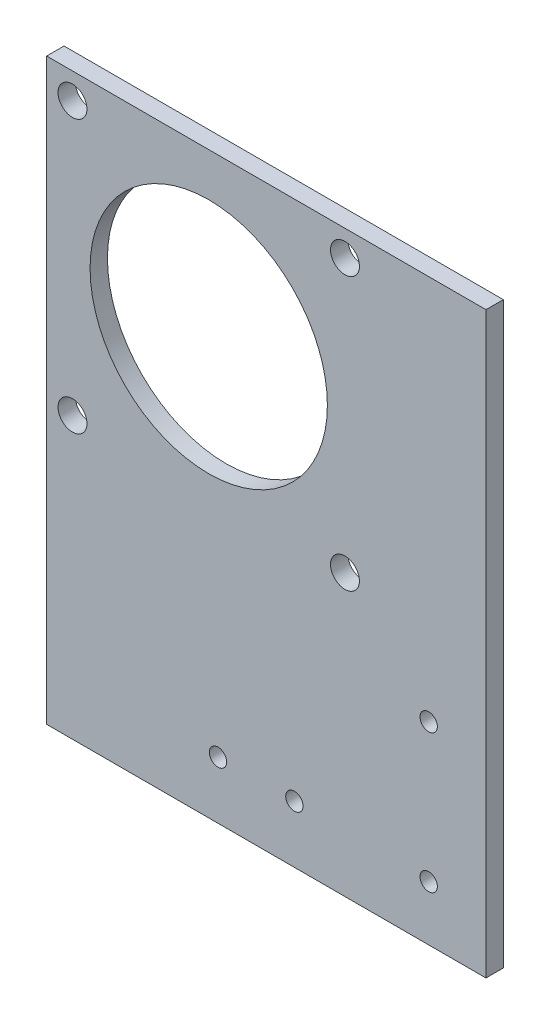
ISO-10303-21;
HEADER;
FILE_DESCRIPTION(('STEP AP214'),'2;1');
FILE_NAME('part.step','',(''),(''),'','','');
FILE_SCHEMA(('AUTOMOTIVE_DESIGN { 1 0 10303 214 1 1 1 1 }'));
ENDSEC;
DATA;
#1=APPLICATION_CONTEXT('core data for automotive mechanical design processes');
#2=APPLICATION_PROTOCOL_DEFINITION('international standard','automotive_design',2000,#1);
#3=PRODUCT_CONTEXT('',#1,'mechanical');
#4=PRODUCT('Part','Part','',(#3));
#5=PRODUCT_RELATED_PRODUCT_CATEGORY('part','',(#4));
#6=PRODUCT_DEFINITION_FORMATION('','',#4);
#7=PRODUCT_DEFINITION_CONTEXT('part definition',#1,'design');
#8=PRODUCT_DEFINITION('design','',#6,#7);
#9=PRODUCT_DEFINITION_SHAPE('','',#8);
#10=(LENGTH_UNIT() NAMED_UNIT(*) SI_UNIT(.MILLI.,.METRE.));
#11=(NAMED_UNIT(*) PLANE_ANGLE_UNIT() SI_UNIT($,.RADIAN.));
#12=(NAMED_UNIT(*) SI_UNIT($,.STERADIAN.) SOLID_ANGLE_UNIT());
#13=UNCERTAINTY_MEASURE_WITH_UNIT(LENGTH_MEASURE(1.E-05),#10,'distance_accuracy_value','');
#14=(GEOMETRIC_REPRESENTATION_CONTEXT(3) GLOBAL_UNCERTAINTY_ASSIGNED_CONTEXT((#13)) GLOBAL_UNIT_ASSIGNED_CONTEXT((#10,
#11,#12)) REPRESENTATION_CONTEXT('',''));
#15=CARTESIAN_POINT('',(0.,0.,0.));
#16=DIRECTION('',(0.,0.,1.));
#17=DIRECTION('',(1.,0.,0.));
#18=AXIS2_PLACEMENT_3D('',#15,#16,#17);
#19=CARTESIAN_POINT('',(0.,0.,3.));
#20=DIRECTION('',(1.,0.,0.));
#21=DIRECTION('',(0.,0.,-1.));
#22=AXIS2_PLACEMENT_3D('',#19,#20,#21);
#23=PLANE('',#22);
#24=DIRECTION('',(0.,-1.,0.));
#25=VECTOR('',#24,1.);
#26=CARTESIAN_POINT('',(0.,0.,0.));
#27=LINE('',#26,#25);
#28=CARTESIAN_POINT('',(0.,100.,0.));
#29=VERTEX_POINT('',#28);
#30=CARTESIAN_POINT('',(0.,0.,0.));
#31=VERTEX_POINT('',#30);
#32=EDGE_CURVE('E99',#29,#31,#27,.T.);
#33=ORIENTED_EDGE('',*,*,#32,.T.);
#34=DIRECTION('',(0.,0.,-1.));
#35=VECTOR('',#34,1.);
#36=CARTESIAN_POINT('',(0.,0.,3.));
#37=LINE('',#36,#35);
#38=CARTESIAN_POINT('',(0.,0.,3.));
#39=VERTEX_POINT('',#38);
#40=EDGE_CURVE('E11',#39,#31,#37,.T.);
#41=ORIENTED_EDGE('',*,*,#40,.F.);
#42=DIRECTION('',(0.,-1.,0.));
#43=VECTOR('',#42,1.);
#44=CARTESIAN_POINT('',(0.,0.,3.));
#45=LINE('',#44,#43);
#46=CARTESIAN_POINT('',(0.,100.,3.));
#47=VERTEX_POINT('',#46);
#48=EDGE_CURVE('E86',#47,#39,#45,.T.);
#49=ORIENTED_EDGE('',*,*,#48,.F.);
#50=DIRECTION('',(0.,0.,-1.));
#51=VECTOR('',#50,1.);
#52=CARTESIAN_POINT('',(0.,100.,3.));
#53=LINE('',#52,#51);
#54=EDGE_CURVE('E95',#47,#29,#53,.T.);
#55=ORIENTED_EDGE('',*,*,#54,.T.);
#56=EDGE_LOOP('',(#33,#41,#49,#55));
#57=FACE_BOUND('',#56,.T.);
#58=ADVANCED_FACE('F33',(#57),#23,.F.);
#59=CARTESIAN_POINT('',(0.,0.,3.));
#60=DIRECTION('',(0.,1.,0.));
#61=DIRECTION('',(0.,0.,1.));
#62=AXIS2_PLACEMENT_3D('',#59,#60,#61);
#63=PLANE('',#62);
#64=DIRECTION('',(1.,0.,0.));
#65=VECTOR('',#64,1.);
#66=CARTESIAN_POINT('',(0.,0.,0.));
#67=LINE('',#66,#65);
#68=CARTESIAN_POINT('',(75.9,0.,0.));
#69=VERTEX_POINT('',#68);
#70=EDGE_CURVE('E90',#31,#69,#67,.T.);
#71=ORIENTED_EDGE('',*,*,#70,.T.);
#72=DIRECTION('',(0.,0.,-1.));
#73=VECTOR('',#72,1.);
#74=CARTESIAN_POINT('',(75.9,0.,3.));
#75=LINE('',#74,#73);
#76=CARTESIAN_POINT('',(75.9,0.,3.));
#77=VERTEX_POINT('',#76);
#78=EDGE_CURVE('E42',#77,#69,#75,.T.);
#79=ORIENTED_EDGE('',*,*,#78,.F.);
#80=DIRECTION('',(1.,0.,0.));
#81=VECTOR('',#80,1.);
#82=CARTESIAN_POINT('',(0.,0.,3.));
#83=LINE('',#82,#81);
#84=EDGE_CURVE('E81',#39,#77,#83,.T.);
#85=ORIENTED_EDGE('',*,*,#84,.F.);
#86=ORIENTED_EDGE('',*,*,#40,.T.);
#87=EDGE_LOOP('',(#71,#79,#85,#86));
#88=FACE_BOUND('',#87,.T.);
#89=ADVANCED_FACE('F89',(#88),#63,.F.);
#90=CARTESIAN_POINT('',(75.9,0.,3.));
#91=DIRECTION('',(-1.,0.,0.));
#92=DIRECTION('',(0.,0.,1.));
#93=AXIS2_PLACEMENT_3D('',#90,#91,#92);
#94=PLANE('',#93);
#95=DIRECTION('',(0.,1.,0.));
#96=VECTOR('',#95,1.);
#97=CARTESIAN_POINT('',(75.9,0.,0.));
#98=LINE('',#97,#96);
#99=CARTESIAN_POINT('',(75.9,100.,0.));
#100=VERTEX_POINT('',#99);
#101=EDGE_CURVE('E68',#69,#100,#98,.T.);
#102=ORIENTED_EDGE('',*,*,#101,.T.);
#103=DIRECTION('',(0.,0.,-1.));
#104=VECTOR('',#103,1.);
#105=CARTESIAN_POINT('',(75.9,100.,3.));
#106=LINE('',#105,#104);
#107=CARTESIAN_POINT('',(75.9,100.,3.));
#108=VERTEX_POINT('',#107);
#109=EDGE_CURVE('E91',#108,#100,#106,.T.);
#110=ORIENTED_EDGE('',*,*,#109,.F.);
#111=DIRECTION('',(0.,1.,0.));
#112=VECTOR('',#111,1.);
#113=CARTESIAN_POINT('',(75.9,0.,3.));
#114=LINE('',#113,#112);
#115=EDGE_CURVE('E84',#77,#108,#114,.T.);
#116=ORIENTED_EDGE('',*,*,#115,.F.);
#117=ORIENTED_EDGE('',*,*,#78,.T.);
#118=EDGE_LOOP('',(#102,#110,#116,#117));
#119=FACE_BOUND('',#118,.T.);
#120=ADVANCED_FACE('F93',(#119),#94,.F.);
#121=CARTESIAN_POINT('',(0.,100.,3.));
#122=DIRECTION('',(0.,-1.,0.));
#123=DIRECTION('',(0.,0.,-1.));
#124=AXIS2_PLACEMENT_3D('',#121,#122,#123);
#125=PLANE('',#124);
#126=DIRECTION('',(-1.,0.,0.));
#127=VECTOR('',#126,1.);
#128=CARTESIAN_POINT('',(0.,100.,0.));
#129=LINE('',#128,#127);
#130=EDGE_CURVE('E74',#100,#29,#129,.T.);
#131=ORIENTED_EDGE('',*,*,#130,.T.);
#132=ORIENTED_EDGE('',*,*,#54,.F.);
#133=DIRECTION('',(-1.,0.,0.));
#134=VECTOR('',#133,1.);
#135=CARTESIAN_POINT('',(0.,100.,3.));
#136=LINE('',#135,#134);
#137=EDGE_CURVE('E51',#108,#47,#136,.T.);
#138=ORIENTED_EDGE('',*,*,#137,.F.);
#139=ORIENTED_EDGE('',*,*,#109,.T.);
#140=EDGE_LOOP('',(#131,#132,#138,#139));
#141=FACE_BOUND('',#140,.T.);
#142=ADVANCED_FACE('F169',(#141),#125,.F.);
#143=CARTESIAN_POINT('',(0.,0.,3.));
#144=DIRECTION('',(0.,0.,-1.));
#145=DIRECTION('',(-1.,0.,0.));
#146=AXIS2_PLACEMENT_3D('',#143,#144,#145);
#147=PLANE('',#146);
#148=CARTESIAN_POINT('',(27.9999999999996,72.,3.));
#149=DIRECTION('',(0.,0.,-1.));
#150=DIRECTION('',(-1.,0.,0.));
#151=AXIS2_PLACEMENT_3D('',#148,#149,#150);
#152=CIRCLE('',#151,20.5);
#153=CARTESIAN_POINT('',(7.49999999999961,72.,3.));
#154=VERTEX_POINT('',#153);
#155=EDGE_CURVE('E292',#154,#154,#152,.T.);
#156=ORIENTED_EDGE('',*,*,#155,.T.);
#157=EDGE_LOOP('',(#156));
#158=FACE_BOUND('',#157,.T.);
#159=CARTESIAN_POINT('',(42.8000000000001,9.90000000000004,3.));
#160=DIRECTION('',(0.,0.,-1.));
#161=DIRECTION('',(-1.,0.,0.));
#162=AXIS2_PLACEMENT_3D('',#159,#160,#161);
#163=CIRCLE('',#162,1.5);
#164=CARTESIAN_POINT('',(41.3000000000001,9.90000000000004,3.));
#165=VERTEX_POINT('',#164);
#166=EDGE_CURVE('E296',#165,#165,#163,.T.);
#167=ORIENTED_EDGE('',*,*,#166,.T.);
#168=EDGE_LOOP('',(#167));
#169=FACE_BOUND('',#168,.T.);
#170=CARTESIAN_POINT('',(29.6000000000001,9.90000000000004,3.));
#171=DIRECTION('',(0.,0.,-1.));
#172=DIRECTION('',(-1.,0.,0.));
#173=AXIS2_PLACEMENT_3D('',#170,#171,#172);
#174=CIRCLE('',#173,1.5);
#175=CARTESIAN_POINT('',(28.1000000000001,9.90000000000004,3.));
#176=VERTEX_POINT('',#175);
#177=EDGE_CURVE('E304',#176,#176,#174,.T.);
#178=ORIENTED_EDGE('',*,*,#177,.T.);
#179=EDGE_LOOP('',(#178));
#180=FACE_BOUND('',#179,.T.);
#181=CARTESIAN_POINT('',(66.0000000000001,9.47099371364919,3.));
#182=DIRECTION('',(0.,0.,1.));
#183=DIRECTION('',(1.,0.,0.));
#184=AXIS2_PLACEMENT_3D('',#181,#182,#183);
#185=CIRCLE('',#184,1.5);
#186=CARTESIAN_POINT('',(67.5000000000001,9.47099371364919,3.));
#187=VERTEX_POINT('',#186);
#188=EDGE_CURVE('E121',#187,#187,#185,.T.);
#189=ORIENTED_EDGE('',*,*,#188,.F.);
#190=EDGE_LOOP('',(#189));
#191=FACE_BOUND('',#190,.T.);
#192=CARTESIAN_POINT('',(66.0000000000001,33.3913700508154,3.));
#193=DIRECTION('',(0.,0.,1.));
#194=DIRECTION('',(1.,0.,0.));
#195=AXIS2_PLACEMENT_3D('',#192,#193,#194);
#196=CIRCLE('',#195,1.5);
#197=CARTESIAN_POINT('',(67.5000000000001,33.3913700508154,3.));
#198=VERTEX_POINT('',#197);
#199=EDGE_CURVE('E110',#198,#198,#196,.T.);
#200=ORIENTED_EDGE('',*,*,#199,.F.);
#201=EDGE_LOOP('',(#200));
#202=FACE_BOUND('',#201,.T.);
#203=CARTESIAN_POINT('',(51.5385822331381,48.4614177668615,3.));
#204=DIRECTION('',(0.,0.,-1.));
#205=DIRECTION('',(-1.,0.,0.));
#206=AXIS2_PLACEMENT_3D('',#203,#204,#205);
#207=CIRCLE('',#206,2.50000000000097);
#208=CARTESIAN_POINT('',(49.0385822331371,48.4614177668615,3.));
#209=VERTEX_POINT('',#208);
#210=EDGE_CURVE('E114',#209,#209,#207,.T.);
#211=ORIENTED_EDGE('',*,*,#210,.T.);
#212=EDGE_LOOP('',(#211));
#213=FACE_BOUND('',#212,.T.);
#214=CARTESIAN_POINT('',(4.46141776686215,48.4614177668615,3.));
#215=DIRECTION('',(0.,0.,-1.));
#216=DIRECTION('',(-1.,0.,0.));
#217=AXIS2_PLACEMENT_3D('',#214,#215,#216);
#218=CIRCLE('',#217,2.50000000000097);
#219=CARTESIAN_POINT('',(1.96141776686118,48.4614177668615,3.));
#220=VERTEX_POINT('',#219);
#221=EDGE_CURVE('E130',#220,#220,#218,.T.);
#222=ORIENTED_EDGE('',*,*,#221,.T.);
#223=EDGE_LOOP('',(#222));
#224=FACE_BOUND('',#223,.T.);
#225=CARTESIAN_POINT('',(4.46141776686213,95.5385822331373,3.));
#226=DIRECTION('',(0.,0.,-1.));
#227=DIRECTION('',(-1.,0.,0.));
#228=AXIS2_PLACEMENT_3D('',#225,#226,#227);
#229=CIRCLE('',#228,2.50000000000097);
#230=CARTESIAN_POINT('',(1.96141776686117,95.5385822331373,3.));
#231=VERTEX_POINT('',#230);
#232=EDGE_CURVE('E136',#231,#231,#229,.T.);
#233=ORIENTED_EDGE('',*,*,#232,.T.);
#234=EDGE_LOOP('',(#233));
#235=FACE_BOUND('',#234,.T.);
#236=CARTESIAN_POINT('',(51.5385822331375,95.5385822331374,3.));
#237=DIRECTION('',(0.,0.,-1.));
#238=DIRECTION('',(-1.,0.,0.));
#239=AXIS2_PLACEMENT_3D('',#236,#237,#238);
#240=CIRCLE('',#239,2.50000000000097);
#241=CARTESIAN_POINT('',(49.0385822331365,95.5385822331374,3.));
#242=VERTEX_POINT('',#241);
#243=EDGE_CURVE('E102',#242,#242,#240,.T.);
#244=ORIENTED_EDGE('',*,*,#243,.T.);
#245=EDGE_LOOP('',(#244));
#246=FACE_BOUND('',#245,.T.);
#247=ORIENTED_EDGE('',*,*,#48,.T.);
#248=ORIENTED_EDGE('',*,*,#84,.T.);
#249=ORIENTED_EDGE('',*,*,#115,.T.);
#250=ORIENTED_EDGE('',*,*,#137,.T.);
#251=EDGE_LOOP('',(#247,#248,#249,#250));
#252=FACE_BOUND('',#251,.T.);
#253=ADVANCED_FACE('F82',(#158,#169,#180,#191,#202,#213,#224,#235,#246,#252),#147,.F.);
#254=CARTESIAN_POINT('',(0.,0.,0.));
#255=DIRECTION('',(0.,0.,-1.));
#256=DIRECTION('',(-1.,0.,0.));
#257=AXIS2_PLACEMENT_3D('',#254,#255,#256);
#258=PLANE('',#257);
#259=CARTESIAN_POINT('',(27.9999999999996,72.,0.));
#260=DIRECTION('',(0.,0.,-1.));
#261=DIRECTION('',(-1.,0.,0.));
#262=AXIS2_PLACEMENT_3D('',#259,#260,#261);
#263=CIRCLE('',#262,20.5);
#264=CARTESIAN_POINT('',(7.49999999999961,72.,0.));
#265=VERTEX_POINT('',#264);
#266=EDGE_CURVE('E289',#265,#265,#263,.T.);
#267=ORIENTED_EDGE('',*,*,#266,.F.);
#268=EDGE_LOOP('',(#267));
#269=FACE_BOUND('',#268,.T.);
#270=CARTESIAN_POINT('',(42.8000000000001,9.90000000000004,0.));
#271=DIRECTION('',(0.,0.,-1.));
#272=DIRECTION('',(-1.,0.,0.));
#273=AXIS2_PLACEMENT_3D('',#270,#271,#272);
#274=CIRCLE('',#273,1.5);
#275=CARTESIAN_POINT('',(41.3000000000001,9.90000000000004,0.));
#276=VERTEX_POINT('',#275);
#277=EDGE_CURVE('E293',#276,#276,#274,.T.);
#278=ORIENTED_EDGE('',*,*,#277,.F.);
#279=EDGE_LOOP('',(#278));
#280=FACE_BOUND('',#279,.T.);
#281=CARTESIAN_POINT('',(29.6000000000001,9.90000000000004,0.));
#282=DIRECTION('',(0.,0.,-1.));
#283=DIRECTION('',(-1.,0.,0.));
#284=AXIS2_PLACEMENT_3D('',#281,#282,#283);
#285=CIRCLE('',#284,1.5);
#286=CARTESIAN_POINT('',(28.1000000000001,9.90000000000004,0.));
#287=VERTEX_POINT('',#286);
#288=EDGE_CURVE('E302',#287,#287,#285,.T.);
#289=ORIENTED_EDGE('',*,*,#288,.F.);
#290=EDGE_LOOP('',(#289));
#291=FACE_BOUND('',#290,.T.);
#292=CARTESIAN_POINT('',(66.0000000000001,9.47099371364919,0.));
#293=DIRECTION('',(0.,0.,-1.));
#294=DIRECTION('',(-1.,0.,0.));
#295=AXIS2_PLACEMENT_3D('',#292,#293,#294);
#296=CIRCLE('',#295,1.5);
#297=CARTESIAN_POINT('',(64.5000000000001,9.47099371364919,0.));
#298=VERTEX_POINT('',#297);
#299=EDGE_CURVE('E36',#298,#298,#296,.T.);
#300=ORIENTED_EDGE('',*,*,#299,.F.);
#301=EDGE_LOOP('',(#300));
#302=FACE_BOUND('',#301,.T.);
#303=CARTESIAN_POINT('',(66.0000000000001,33.3913700508154,0.));
#304=DIRECTION('',(0.,0.,-1.));
#305=DIRECTION('',(-1.,0.,0.));
#306=AXIS2_PLACEMENT_3D('',#303,#304,#305);
#307=CIRCLE('',#306,1.5);
#308=CARTESIAN_POINT('',(64.5000000000001,33.3913700508154,0.));
#309=VERTEX_POINT('',#308);
#310=EDGE_CURVE('E107',#309,#309,#307,.T.);
#311=ORIENTED_EDGE('',*,*,#310,.F.);
#312=EDGE_LOOP('',(#311));
#313=FACE_BOUND('',#312,.T.);
#314=CARTESIAN_POINT('',(51.5385822331381,48.4614177668615,0.));
#315=DIRECTION('',(0.,0.,-1.));
#316=DIRECTION('',(-1.,0.,0.));
#317=AXIS2_PLACEMENT_3D('',#314,#315,#316);
#318=CIRCLE('',#317,2.50000000000097);
#319=CARTESIAN_POINT('',(49.0385822331371,48.4614177668615,0.));
#320=VERTEX_POINT('',#319);
#321=EDGE_CURVE('E109',#320,#320,#318,.T.);
#322=ORIENTED_EDGE('',*,*,#321,.F.);
#323=EDGE_LOOP('',(#322));
#324=FACE_BOUND('',#323,.T.);
#325=CARTESIAN_POINT('',(4.46141776686215,48.4614177668615,0.));
#326=DIRECTION('',(0.,0.,-1.));
#327=DIRECTION('',(-1.,0.,0.));
#328=AXIS2_PLACEMENT_3D('',#325,#326,#327);
#329=CIRCLE('',#328,2.50000000000097);
#330=CARTESIAN_POINT('',(1.96141776686118,48.4614177668615,0.));
#331=VERTEX_POINT('',#330);
#332=EDGE_CURVE('E127',#331,#331,#329,.T.);
#333=ORIENTED_EDGE('',*,*,#332,.F.);
#334=EDGE_LOOP('',(#333));
#335=FACE_BOUND('',#334,.T.);
#336=CARTESIAN_POINT('',(4.46141776686213,95.5385822331373,0.));
#337=DIRECTION('',(0.,0.,-1.));
#338=DIRECTION('',(-1.,0.,0.));
#339=AXIS2_PLACEMENT_3D('',#336,#337,#338);
#340=CIRCLE('',#339,2.50000000000097);
#341=CARTESIAN_POINT('',(1.96141776686117,95.5385822331373,0.));
#342=VERTEX_POINT('',#341);
#343=EDGE_CURVE('E133',#342,#342,#340,.T.);
#344=ORIENTED_EDGE('',*,*,#343,.F.);
#345=EDGE_LOOP('',(#344));
#346=FACE_BOUND('',#345,.T.);
#347=CARTESIAN_POINT('',(51.5385822331375,95.5385822331374,0.));
#348=DIRECTION('',(0.,0.,-1.));
#349=DIRECTION('',(-1.,0.,0.));
#350=AXIS2_PLACEMENT_3D('',#347,#348,#349);
#351=CIRCLE('',#350,2.50000000000097);
#352=CARTESIAN_POINT('',(49.0385822331365,95.5385822331374,0.));
#353=VERTEX_POINT('',#352);
#354=EDGE_CURVE('E139',#353,#353,#351,.T.);
#355=ORIENTED_EDGE('',*,*,#354,.F.);
#356=EDGE_LOOP('',(#355));
#357=FACE_BOUND('',#356,.T.);
#358=ORIENTED_EDGE('',*,*,#32,.F.);
#359=ORIENTED_EDGE('',*,*,#130,.F.);
#360=ORIENTED_EDGE('',*,*,#101,.F.);
#361=ORIENTED_EDGE('',*,*,#70,.F.);
#362=EDGE_LOOP('',(#358,#359,#360,#361));
#363=FACE_BOUND('',#362,.T.);
#364=ADVANCED_FACE('F149',(#269,#280,#291,#302,#313,#324,#335,#346,#357,#363),#258,.T.);
#365=CARTESIAN_POINT('',(51.5385822331375,95.5385822331374,10.));
#366=DIRECTION('',(0.,0.,-1.));
#367=DIRECTION('',(-1.,0.,0.));
#368=AXIS2_PLACEMENT_3D('',#365,#366,#367);
#369=CYLINDRICAL_SURFACE('',#368,2.50000000000097);
#370=ORIENTED_EDGE('',*,*,#354,.T.);
#371=EDGE_LOOP('',(#370));
#372=FACE_BOUND('',#371,.T.);
#373=ORIENTED_EDGE('',*,*,#243,.F.);
#374=EDGE_LOOP('',(#373));
#375=FACE_BOUND('',#374,.T.);
#376=ADVANCED_FACE('F146',(#372,#375),#369,.F.);
#377=CARTESIAN_POINT('',(4.46141776686213,95.5385822331373,10.));
#378=DIRECTION('',(0.,0.,-1.));
#379=DIRECTION('',(-1.,0.,0.));
#380=AXIS2_PLACEMENT_3D('',#377,#378,#379);
#381=CYLINDRICAL_SURFACE('',#380,2.50000000000097);
#382=ORIENTED_EDGE('',*,*,#343,.T.);
#383=EDGE_LOOP('',(#382));
#384=FACE_BOUND('',#383,.T.);
#385=ORIENTED_EDGE('',*,*,#232,.F.);
#386=EDGE_LOOP('',(#385));
#387=FACE_BOUND('',#386,.T.);
#388=ADVANCED_FACE('F148',(#384,#387),#381,.F.);
#389=CARTESIAN_POINT('',(4.46141776686215,48.4614177668615,10.));
#390=DIRECTION('',(0.,0.,-1.));
#391=DIRECTION('',(-1.,0.,0.));
#392=AXIS2_PLACEMENT_3D('',#389,#390,#391);
#393=CYLINDRICAL_SURFACE('',#392,2.50000000000097);
#394=ORIENTED_EDGE('',*,*,#332,.T.);
#395=EDGE_LOOP('',(#394));
#396=FACE_BOUND('',#395,.T.);
#397=ORIENTED_EDGE('',*,*,#221,.F.);
#398=EDGE_LOOP('',(#397));
#399=FACE_BOUND('',#398,.T.);
#400=ADVANCED_FACE('F156',(#396,#399),#393,.F.);
#401=CARTESIAN_POINT('',(51.5385822331381,48.4614177668615,10.));
#402=DIRECTION('',(0.,0.,-1.));
#403=DIRECTION('',(-1.,0.,0.));
#404=AXIS2_PLACEMENT_3D('',#401,#402,#403);
#405=CYLINDRICAL_SURFACE('',#404,2.50000000000097);
#406=ORIENTED_EDGE('',*,*,#321,.T.);
#407=EDGE_LOOP('',(#406));
#408=FACE_BOUND('',#407,.T.);
#409=ORIENTED_EDGE('',*,*,#210,.F.);
#410=EDGE_LOOP('',(#409));
#411=FACE_BOUND('',#410,.T.);
#412=ADVANCED_FACE('F225',(#408,#411),#405,.F.);
#413=CARTESIAN_POINT('',(66.0000000000001,33.3913700508154,-7.));
#414=DIRECTION('',(0.,0.,1.));
#415=DIRECTION('',(1.,0.,0.));
#416=AXIS2_PLACEMENT_3D('',#413,#414,#415);
#417=CYLINDRICAL_SURFACE('',#416,1.5);
#418=ORIENTED_EDGE('',*,*,#310,.T.);
#419=EDGE_LOOP('',(#418));
#420=FACE_BOUND('',#419,.T.);
#421=ORIENTED_EDGE('',*,*,#199,.T.);
#422=EDGE_LOOP('',(#421));
#423=FACE_BOUND('',#422,.T.);
#424=ADVANCED_FACE('F234',(#420,#423),#417,.F.);
#425=CARTESIAN_POINT('',(66.0000000000001,9.47099371364919,-7.));
#426=DIRECTION('',(0.,0.,1.));
#427=DIRECTION('',(1.,0.,0.));
#428=AXIS2_PLACEMENT_3D('',#425,#426,#427);
#429=CYLINDRICAL_SURFACE('',#428,1.5);
#430=ORIENTED_EDGE('',*,*,#299,.T.);
#431=EDGE_LOOP('',(#430));
#432=FACE_BOUND('',#431,.T.);
#433=ORIENTED_EDGE('',*,*,#188,.T.);
#434=EDGE_LOOP('',(#433));
#435=FACE_BOUND('',#434,.T.);
#436=ADVANCED_FACE('F243',(#432,#435),#429,.F.);
#437=CARTESIAN_POINT('',(29.6000000000001,9.90000000000004,19.8));
#438=DIRECTION('',(0.,0.,-1.));
#439=DIRECTION('',(-1.,0.,0.));
#440=AXIS2_PLACEMENT_3D('',#437,#438,#439);
#441=CYLINDRICAL_SURFACE('',#440,1.5);
#442=CARTESIAN_POINT('',(28.1000000000001,9.90000000000004,0.));
#443=CARTESIAN_POINT('',(28.1000000000001,9.90000000000004,0.03125));
#444=CARTESIAN_POINT('',(28.1000000000001,9.90000000000004,0.0625000000000001));
#445=CARTESIAN_POINT('',(28.1000000000001,9.90000000000004,0.125));
#446=CARTESIAN_POINT('',(28.1000000000001,9.90000000000004,0.15625));
#447=CARTESIAN_POINT('',(28.1000000000001,9.90000000000004,0.21875));
#448=CARTESIAN_POINT('',(28.1000000000001,9.90000000000004,0.25));
#449=CARTESIAN_POINT('',(28.1000000000001,9.90000000000004,0.3125));
#450=CARTESIAN_POINT('',(28.1000000000001,9.90000000000004,0.34375));
#451=CARTESIAN_POINT('',(28.1000000000001,9.90000000000004,0.40625));
#452=CARTESIAN_POINT('',(28.1000000000001,9.90000000000004,0.4375));
#453=CARTESIAN_POINT('',(28.1000000000001,9.90000000000004,0.5));
#454=CARTESIAN_POINT('',(28.1000000000001,9.90000000000004,0.53125));
#455=CARTESIAN_POINT('',(28.1000000000001,9.90000000000004,0.593750000000001));
#456=CARTESIAN_POINT('',(28.1000000000001,9.90000000000004,0.625000000000001));
#457=CARTESIAN_POINT('',(28.1000000000001,9.90000000000004,0.687500000000001));
#458=CARTESIAN_POINT('',(28.1000000000001,9.90000000000004,0.718750000000001));
#459=CARTESIAN_POINT('',(28.1000000000001,9.90000000000004,0.781250000000001));
#460=CARTESIAN_POINT('',(28.1000000000001,9.90000000000004,0.812500000000001));
#461=CARTESIAN_POINT('',(28.1000000000001,9.90000000000004,0.875000000000001));
#462=CARTESIAN_POINT('',(28.1000000000001,9.90000000000004,0.906250000000001));
#463=CARTESIAN_POINT('',(28.1000000000001,9.90000000000004,0.968750000000001));
#464=CARTESIAN_POINT('',(28.1000000000001,9.90000000000004,1.));
#465=CARTESIAN_POINT('',(28.1000000000001,9.90000000000004,1.0625));
#466=CARTESIAN_POINT('',(28.1000000000001,9.90000000000004,1.09375));
#467=CARTESIAN_POINT('',(28.1000000000001,9.90000000000004,1.15625));
#468=CARTESIAN_POINT('',(28.1000000000001,9.90000000000004,1.1875));
#469=CARTESIAN_POINT('',(28.1000000000001,9.90000000000004,1.25));
#470=CARTESIAN_POINT('',(28.1000000000001,9.90000000000004,1.28125));
#471=CARTESIAN_POINT('',(28.1000000000001,9.90000000000004,1.34375));
#472=CARTESIAN_POINT('',(28.1000000000001,9.90000000000004,1.375));
#473=CARTESIAN_POINT('',(28.1000000000001,9.90000000000004,1.4375));
#474=CARTESIAN_POINT('',(28.1000000000001,9.90000000000004,1.46875));
#475=CARTESIAN_POINT('',(28.1000000000001,9.90000000000004,1.53125));
#476=CARTESIAN_POINT('',(28.1000000000001,9.90000000000004,1.5625));
#477=CARTESIAN_POINT('',(28.1000000000001,9.90000000000004,1.625));
#478=CARTESIAN_POINT('',(28.1000000000001,9.90000000000004,1.65625));
#479=CARTESIAN_POINT('',(28.1000000000001,9.90000000000004,1.71875));
#480=CARTESIAN_POINT('',(28.1000000000001,9.90000000000004,1.75));
#481=CARTESIAN_POINT('',(28.1000000000001,9.90000000000004,1.8125));
#482=CARTESIAN_POINT('',(28.1000000000001,9.90000000000004,1.84375));
#483=CARTESIAN_POINT('',(28.1000000000001,9.90000000000004,1.90625));
#484=CARTESIAN_POINT('',(28.1000000000001,9.90000000000004,1.9375));
#485=CARTESIAN_POINT('',(28.1000000000001,9.90000000000004,2.));
#486=CARTESIAN_POINT('',(28.1000000000001,9.90000000000004,2.03125));
#487=CARTESIAN_POINT('',(28.1000000000001,9.90000000000004,2.09375));
#488=CARTESIAN_POINT('',(28.1000000000001,9.90000000000004,2.125));
#489=CARTESIAN_POINT('',(28.1000000000001,9.90000000000004,2.1875));
#490=CARTESIAN_POINT('',(28.1000000000001,9.90000000000004,2.21875));
#491=CARTESIAN_POINT('',(28.1000000000001,9.90000000000004,2.28125));
#492=CARTESIAN_POINT('',(28.1000000000001,9.90000000000004,2.3125));
#493=CARTESIAN_POINT('',(28.1000000000001,9.90000000000004,2.375));
#494=CARTESIAN_POINT('',(28.1000000000001,9.90000000000004,2.40625));
#495=CARTESIAN_POINT('',(28.1000000000001,9.90000000000004,2.46875));
#496=CARTESIAN_POINT('',(28.1000000000001,9.90000000000004,2.5));
#497=CARTESIAN_POINT('',(28.1000000000001,9.90000000000004,2.5625));
#498=CARTESIAN_POINT('',(28.1000000000001,9.90000000000004,2.59375));
#499=CARTESIAN_POINT('',(28.1000000000001,9.90000000000004,2.65625));
#500=CARTESIAN_POINT('',(28.1000000000001,9.90000000000004,2.6875));
#501=CARTESIAN_POINT('',(28.1000000000001,9.90000000000004,2.75));
#502=CARTESIAN_POINT('',(28.1000000000001,9.90000000000004,2.78125));
#503=CARTESIAN_POINT('',(28.1000000000001,9.90000000000004,2.84375));
#504=CARTESIAN_POINT('',(28.1000000000001,9.90000000000004,2.875));
#505=CARTESIAN_POINT('',(28.1000000000001,9.90000000000004,2.9375));
#506=CARTESIAN_POINT('',(28.1000000000001,9.90000000000004,2.96875));
#507=CARTESIAN_POINT('',(28.1000000000001,9.90000000000004,3.));
#508=B_SPLINE_CURVE_WITH_KNOTS('',3,(#442,#443,#444,#445,#446,#447,#448,#449,#450,#451,#452,
#453,#454,#455,#456,#457,#458,#459,#460,#461,#462,#463,#464,#465,#466,#467,#468,#469,#470,#471,
#472,#473,#474,#475,#476,#477,#478,#479,#480,#481,#482,#483,#484,#485,#486,#487,#488,#489,#490,
#491,#492,#493,#494,#495,#496,#497,#498,#499,#500,#501,#502,#503,#504,#505,#506,#507),
.UNSPECIFIED.,.F.,.F.,(4,2,2,2,2,2,2,2,2,2,2,2,2,2,2,2,2,2,2,2,2,2,2,2,2,2,2,2,2,2,2,2,4),(0.,
0.0937500000000001,0.1875,0.28125,0.375,0.46875,0.5625,0.656250000000001,0.750000000000001,
0.843750000000001,0.937500000000001,1.03125,1.125,1.21875,1.3125,1.40625,1.5,1.59375,1.6875,
1.78125,1.875,1.96875,2.0625,2.15625,2.25,2.34375,2.4375,2.53125,2.625,2.71875,2.8125,2.90625,
3.),.UNSPECIFIED.);
#509=EDGE_CURVE('BSEAM251',#287,#176,#508,.T.);
#510=ORIENTED_EDGE('',*,*,#288,.T.);
#511=ORIENTED_EDGE('',*,*,#177,.F.);
#512=ORIENTED_EDGE('',*,*,#509,.T.);
#513=ORIENTED_EDGE('',*,*,#509,.F.);
#514=EDGE_LOOP('',(#510,#512,#511,#513));
#515=FACE_BOUND('',#514,.T.);
#516=ADVANCED_FACE('F251',(#515),#441,.F.);
#517=CARTESIAN_POINT('',(42.8000000000001,9.90000000000004,19.8));
#518=DIRECTION('',(0.,0.,-1.));
#519=DIRECTION('',(-1.,0.,0.));
#520=AXIS2_PLACEMENT_3D('',#517,#518,#519);
#521=CYLINDRICAL_SURFACE('',#520,1.5);
#522=CARTESIAN_POINT('',(41.3000000000001,9.90000000000004,0.));
#523=CARTESIAN_POINT('',(41.3000000000001,9.90000000000004,0.03125));
#524=CARTESIAN_POINT('',(41.3000000000001,9.90000000000004,0.0625000000000001));
#525=CARTESIAN_POINT('',(41.3000000000001,9.90000000000004,0.125));
#526=CARTESIAN_POINT('',(41.3000000000001,9.90000000000004,0.15625));
#527=CARTESIAN_POINT('',(41.3000000000001,9.90000000000004,0.21875));
#528=CARTESIAN_POINT('',(41.3000000000001,9.90000000000004,0.25));
#529=CARTESIAN_POINT('',(41.3000000000001,9.90000000000004,0.3125));
#530=CARTESIAN_POINT('',(41.3000000000001,9.90000000000004,0.34375));
#531=CARTESIAN_POINT('',(41.3000000000001,9.90000000000004,0.40625));
#532=CARTESIAN_POINT('',(41.3000000000001,9.90000000000004,0.4375));
#533=CARTESIAN_POINT('',(41.3000000000001,9.90000000000004,0.5));
#534=CARTESIAN_POINT('',(41.3000000000001,9.90000000000004,0.53125));
#535=CARTESIAN_POINT('',(41.3000000000001,9.90000000000004,0.593750000000001));
#536=CARTESIAN_POINT('',(41.3000000000001,9.90000000000004,0.625000000000001));
#537=CARTESIAN_POINT('',(41.3000000000001,9.90000000000004,0.687500000000001));
#538=CARTESIAN_POINT('',(41.3000000000001,9.90000000000004,0.718750000000001));
#539=CARTESIAN_POINT('',(41.3000000000001,9.90000000000004,0.781250000000001));
#540=CARTESIAN_POINT('',(41.3000000000001,9.90000000000004,0.812500000000001));
#541=CARTESIAN_POINT('',(41.3000000000001,9.90000000000004,0.875000000000001));
#542=CARTESIAN_POINT('',(41.3000000000001,9.90000000000004,0.906250000000001));
#543=CARTESIAN_POINT('',(41.3000000000001,9.90000000000004,0.968750000000001));
#544=CARTESIAN_POINT('',(41.3000000000001,9.90000000000004,1.));
#545=CARTESIAN_POINT('',(41.3000000000001,9.90000000000004,1.0625));
#546=CARTESIAN_POINT('',(41.3000000000001,9.90000000000004,1.09375));
#547=CARTESIAN_POINT('',(41.3000000000001,9.90000000000004,1.15625));
#548=CARTESIAN_POINT('',(41.3000000000001,9.90000000000004,1.1875));
#549=CARTESIAN_POINT('',(41.3000000000001,9.90000000000004,1.25));
#550=CARTESIAN_POINT('',(41.3000000000001,9.90000000000004,1.28125));
#551=CARTESIAN_POINT('',(41.3000000000001,9.90000000000004,1.34375));
#552=CARTESIAN_POINT('',(41.3000000000001,9.90000000000004,1.375));
#553=CARTESIAN_POINT('',(41.3000000000001,9.90000000000004,1.4375));
#554=CARTESIAN_POINT('',(41.3000000000001,9.90000000000004,1.46875));
#555=CARTESIAN_POINT('',(41.3000000000001,9.90000000000004,1.53125));
#556=CARTESIAN_POINT('',(41.3000000000001,9.90000000000004,1.5625));
#557=CARTESIAN_POINT('',(41.3000000000001,9.90000000000004,1.625));
#558=CARTESIAN_POINT('',(41.3000000000001,9.90000000000004,1.65625));
#559=CARTESIAN_POINT('',(41.3000000000001,9.90000000000004,1.71875));
#560=CARTESIAN_POINT('',(41.3000000000001,9.90000000000004,1.75));
#561=CARTESIAN_POINT('',(41.3000000000001,9.90000000000004,1.8125));
#562=CARTESIAN_POINT('',(41.3000000000001,9.90000000000004,1.84375));
#563=CARTESIAN_POINT('',(41.3000000000001,9.90000000000004,1.90625));
#564=CARTESIAN_POINT('',(41.3000000000001,9.90000000000004,1.9375));
#565=CARTESIAN_POINT('',(41.3000000000001,9.90000000000004,2.));
#566=CARTESIAN_POINT('',(41.3000000000001,9.90000000000004,2.03125));
#567=CARTESIAN_POINT('',(41.3000000000001,9.90000000000004,2.09375));
#568=CARTESIAN_POINT('',(41.3000000000001,9.90000000000004,2.125));
#569=CARTESIAN_POINT('',(41.3000000000001,9.90000000000004,2.1875));
#570=CARTESIAN_POINT('',(41.3000000000001,9.90000000000004,2.21875));
#571=CARTESIAN_POINT('',(41.3000000000001,9.90000000000004,2.28125));
#572=CARTESIAN_POINT('',(41.3000000000001,9.90000000000004,2.3125));
#573=CARTESIAN_POINT('',(41.3000000000001,9.90000000000004,2.375));
#574=CARTESIAN_POINT('',(41.3000000000001,9.90000000000004,2.40625));
#575=CARTESIAN_POINT('',(41.3000000000001,9.90000000000004,2.46875));
#576=CARTESIAN_POINT('',(41.3000000000001,9.90000000000004,2.5));
#577=CARTESIAN_POINT('',(41.3000000000001,9.90000000000004,2.5625));
#578=CARTESIAN_POINT('',(41.3000000000001,9.90000000000004,2.59375));
#579=CARTESIAN_POINT('',(41.3000000000001,9.90000000000004,2.65625));
#580=CARTESIAN_POINT('',(41.3000000000001,9.90000000000004,2.6875));
#581=CARTESIAN_POINT('',(41.3000000000001,9.90000000000004,2.75));
#582=CARTESIAN_POINT('',(41.3000000000001,9.90000000000004,2.78125));
#583=CARTESIAN_POINT('',(41.3000000000001,9.90000000000004,2.84375));
#584=CARTESIAN_POINT('',(41.3000000000001,9.90000000000004,2.875));
#585=CARTESIAN_POINT('',(41.3000000000001,9.90000000000004,2.9375));
#586=CARTESIAN_POINT('',(41.3000000000001,9.90000000000004,2.96875));
#587=CARTESIAN_POINT('',(41.3000000000001,9.90000000000004,3.));
#588=B_SPLINE_CURVE_WITH_KNOTS('',3,(#522,#523,#524,#525,#526,#527,#528,#529,#530,#531,#532,
#533,#534,#535,#536,#537,#538,#539,#540,#541,#542,#543,#544,#545,#546,#547,#548,#549,#550,#551,
#552,#553,#554,#555,#556,#557,#558,#559,#560,#561,#562,#563,#564,#565,#566,#567,#568,#569,#570,
#571,#572,#573,#574,#575,#576,#577,#578,#579,#580,#581,#582,#583,#584,#585,#586,#587),
.UNSPECIFIED.,.F.,.F.,(4,2,2,2,2,2,2,2,2,2,2,2,2,2,2,2,2,2,2,2,2,2,2,2,2,2,2,2,2,2,2,2,4),(0.,
0.0937500000000001,0.1875,0.28125,0.375,0.46875,0.5625,0.656250000000001,0.750000000000001,
0.843750000000001,0.937500000000001,1.03125,1.125,1.21875,1.3125,1.40625,1.5,1.59375,1.6875,
1.78125,1.875,1.96875,2.0625,2.15625,2.25,2.34375,2.4375,2.53125,2.625,2.71875,2.8125,2.90625,
3.),.UNSPECIFIED.);
#589=EDGE_CURVE('BSEAM260',#276,#165,#588,.T.);
#590=ORIENTED_EDGE('',*,*,#277,.T.);
#591=ORIENTED_EDGE('',*,*,#166,.F.);
#592=ORIENTED_EDGE('',*,*,#589,.T.);
#593=ORIENTED_EDGE('',*,*,#589,.F.);
#594=EDGE_LOOP('',(#590,#592,#591,#593));
#595=FACE_BOUND('',#594,.T.);
#596=ADVANCED_FACE('F260',(#595),#521,.F.);
#597=CARTESIAN_POINT('',(27.9999999999996,72.,19.8));
#598=DIRECTION('',(0.,0.,-1.));
#599=DIRECTION('',(-1.,0.,0.));
#600=AXIS2_PLACEMENT_3D('',#597,#598,#599);
#601=CYLINDRICAL_SURFACE('',#600,20.5);
#602=CARTESIAN_POINT('',(7.49999999999961,72.,0.));
#603=CARTESIAN_POINT('',(7.49999999999961,72.,0.03125));
#604=CARTESIAN_POINT('',(7.49999999999961,72.,0.0625000000000001));
#605=CARTESIAN_POINT('',(7.49999999999961,72.,0.125));
#606=CARTESIAN_POINT('',(7.49999999999961,72.,0.15625));
#607=CARTESIAN_POINT('',(7.49999999999961,72.,0.21875));
#608=CARTESIAN_POINT('',(7.49999999999961,72.,0.25));
#609=CARTESIAN_POINT('',(7.49999999999961,72.,0.3125));
#610=CARTESIAN_POINT('',(7.49999999999961,72.,0.34375));
#611=CARTESIAN_POINT('',(7.49999999999961,72.,0.40625));
#612=CARTESIAN_POINT('',(7.49999999999961,72.,0.4375));
#613=CARTESIAN_POINT('',(7.49999999999961,72.,0.5));
#614=CARTESIAN_POINT('',(7.49999999999961,72.,0.53125));
#615=CARTESIAN_POINT('',(7.49999999999961,72.,0.593750000000001));
#616=CARTESIAN_POINT('',(7.49999999999961,72.,0.625000000000001));
#617=CARTESIAN_POINT('',(7.49999999999961,72.,0.687500000000001));
#618=CARTESIAN_POINT('',(7.49999999999961,72.,0.718750000000001));
#619=CARTESIAN_POINT('',(7.49999999999961,72.,0.781250000000001));
#620=CARTESIAN_POINT('',(7.49999999999961,72.,0.812500000000001));
#621=CARTESIAN_POINT('',(7.49999999999961,72.,0.875000000000001));
#622=CARTESIAN_POINT('',(7.49999999999961,72.,0.906250000000001));
#623=CARTESIAN_POINT('',(7.49999999999961,72.,0.968750000000001));
#624=CARTESIAN_POINT('',(7.49999999999961,72.,1.));
#625=CARTESIAN_POINT('',(7.49999999999961,72.,1.0625));
#626=CARTESIAN_POINT('',(7.49999999999961,72.,1.09375));
#627=CARTESIAN_POINT('',(7.49999999999961,72.,1.15625));
#628=CARTESIAN_POINT('',(7.49999999999961,72.,1.1875));
#629=CARTESIAN_POINT('',(7.49999999999961,72.,1.25));
#630=CARTESIAN_POINT('',(7.49999999999961,72.,1.28125));
#631=CARTESIAN_POINT('',(7.49999999999961,72.,1.34375));
#632=CARTESIAN_POINT('',(7.49999999999961,72.,1.375));
#633=CARTESIAN_POINT('',(7.49999999999961,72.,1.4375));
#634=CARTESIAN_POINT('',(7.49999999999961,72.,1.46875));
#635=CARTESIAN_POINT('',(7.49999999999961,72.,1.53125));
#636=CARTESIAN_POINT('',(7.49999999999961,72.,1.5625));
#637=CARTESIAN_POINT('',(7.49999999999961,72.,1.625));
#638=CARTESIAN_POINT('',(7.49999999999961,72.,1.65625));
#639=CARTESIAN_POINT('',(7.49999999999961,72.,1.71875));
#640=CARTESIAN_POINT('',(7.49999999999961,72.,1.75));
#641=CARTESIAN_POINT('',(7.49999999999961,72.,1.8125));
#642=CARTESIAN_POINT('',(7.49999999999961,72.,1.84375));
#643=CARTESIAN_POINT('',(7.49999999999961,72.,1.90625));
#644=CARTESIAN_POINT('',(7.49999999999961,72.,1.9375));
#645=CARTESIAN_POINT('',(7.49999999999961,72.,2.));
#646=CARTESIAN_POINT('',(7.49999999999961,72.,2.03125));
#647=CARTESIAN_POINT('',(7.49999999999961,72.,2.09375));
#648=CARTESIAN_POINT('',(7.49999999999961,72.,2.125));
#649=CARTESIAN_POINT('',(7.49999999999961,72.,2.1875));
#650=CARTESIAN_POINT('',(7.49999999999961,72.,2.21875));
#651=CARTESIAN_POINT('',(7.49999999999961,72.,2.28125));
#652=CARTESIAN_POINT('',(7.49999999999961,72.,2.3125));
#653=CARTESIAN_POINT('',(7.49999999999961,72.,2.375));
#654=CARTESIAN_POINT('',(7.49999999999961,72.,2.40625));
#655=CARTESIAN_POINT('',(7.49999999999961,72.,2.46875));
#656=CARTESIAN_POINT('',(7.49999999999961,72.,2.5));
#657=CARTESIAN_POINT('',(7.49999999999961,72.,2.5625));
#658=CARTESIAN_POINT('',(7.49999999999961,72.,2.59375));
#659=CARTESIAN_POINT('',(7.49999999999961,72.,2.65625));
#660=CARTESIAN_POINT('',(7.49999999999961,72.,2.6875));
#661=CARTESIAN_POINT('',(7.49999999999961,72.,2.75));
#662=CARTESIAN_POINT('',(7.49999999999961,72.,2.78125));
#663=CARTESIAN_POINT('',(7.49999999999961,72.,2.84375));
#664=CARTESIAN_POINT('',(7.49999999999961,72.,2.875));
#665=CARTESIAN_POINT('',(7.49999999999961,72.,2.9375));
#666=CARTESIAN_POINT('',(7.49999999999961,72.,2.96875));
#667=CARTESIAN_POINT('',(7.49999999999961,72.,3.));
#668=B_SPLINE_CURVE_WITH_KNOTS('',3,(#602,#603,#604,#605,#606,#607,#608,#609,#610,#611,#612,
#613,#614,#615,#616,#617,#618,#619,#620,#621,#622,#623,#624,#625,#626,#627,#628,#629,#630,#631,
#632,#633,#634,#635,#636,#637,#638,#639,#640,#641,#642,#643,#644,#645,#646,#647,#648,#649,#650,
#651,#652,#653,#654,#655,#656,#657,#658,#659,#660,#661,#662,#663,#664,#665,#666,#667),
.UNSPECIFIED.,.F.,.F.,(4,2,2,2,2,2,2,2,2,2,2,2,2,2,2,2,2,2,2,2,2,2,2,2,2,2,2,2,2,2,2,2,4),(0.,
0.0937500000000001,0.1875,0.28125,0.375,0.46875,0.5625,0.656250000000001,0.750000000000001,
0.843750000000001,0.937500000000001,1.03125,1.125,1.21875,1.3125,1.40625,1.5,1.59375,1.6875,
1.78125,1.875,1.96875,2.0625,2.15625,2.25,2.34375,2.4375,2.53125,2.625,2.71875,2.8125,2.90625,
3.),.UNSPECIFIED.);
#669=EDGE_CURVE('BSEAM268',#265,#154,#668,.T.);
#670=ORIENTED_EDGE('',*,*,#266,.T.);
#671=ORIENTED_EDGE('',*,*,#155,.F.);
#672=ORIENTED_EDGE('',*,*,#669,.T.);
#673=ORIENTED_EDGE('',*,*,#669,.F.);
#674=EDGE_LOOP('',(#670,#672,#671,#673));
#675=FACE_BOUND('',#674,.T.);
#676=ADVANCED_FACE('F268',(#675),#601,.F.);
#677=CLOSED_SHELL('',(#58,#89,#120,#142,#253,#364,#376,#388,#400,#412,#424,#436,#516,#596,#676));
#678=MANIFOLD_SOLID_BREP('B2',#677);
#679=ADVANCED_BREP_SHAPE_REPRESENTATION('',(#18,#678),#14);
#680=SHAPE_DEFINITION_REPRESENTATION(#9,#679);
ENDSEC;
END-ISO-10303-21;
